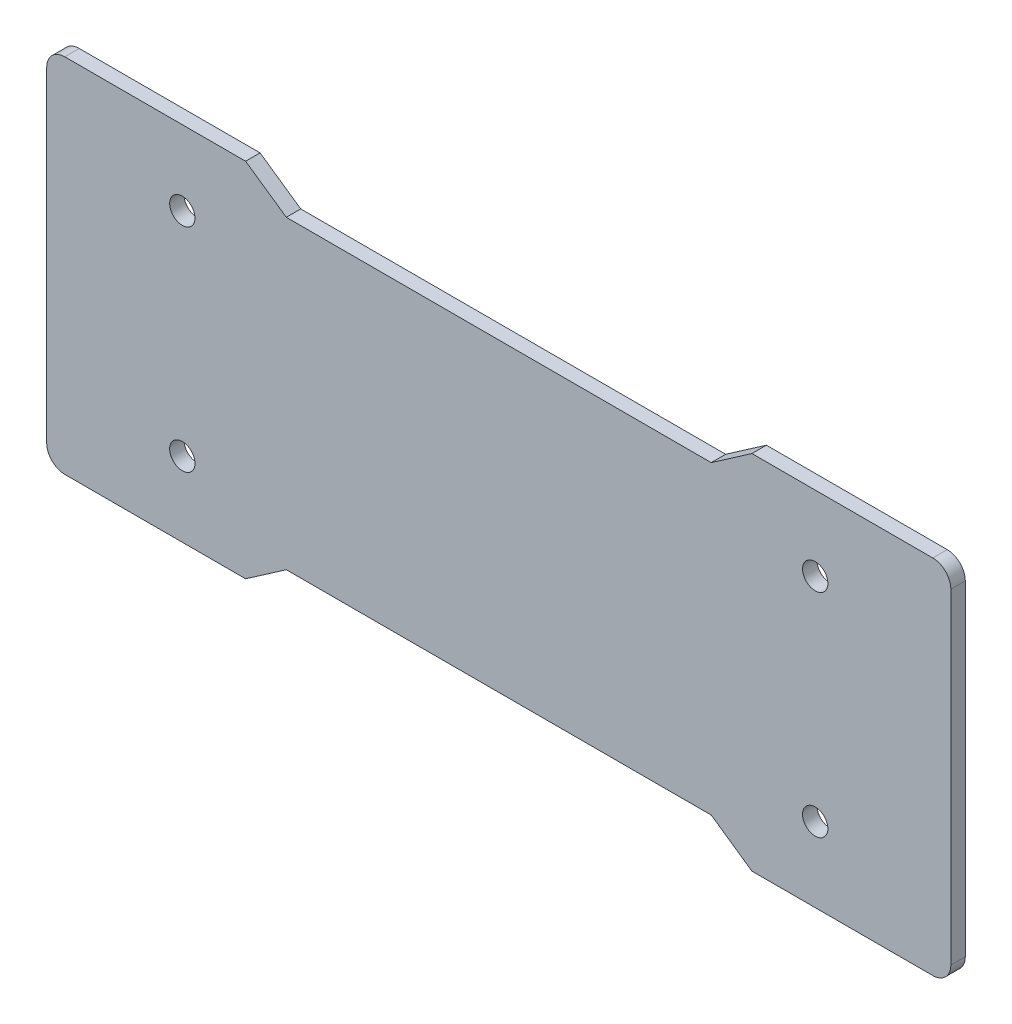
ISO-10303-21;
HEADER;
FILE_DESCRIPTION(('STEP AP214'),'2;1');
FILE_NAME('part.step','',(''),(''),'','','');
FILE_SCHEMA(('AUTOMOTIVE_DESIGN { 1 0 10303 214 1 1 1 1 }'));
ENDSEC;
DATA;
#1=APPLICATION_CONTEXT('core data for automotive mechanical design processes');
#2=APPLICATION_PROTOCOL_DEFINITION('international standard','automotive_design',2000,#1);
#3=PRODUCT_CONTEXT('',#1,'mechanical');
#4=PRODUCT('Part','Part','',(#3));
#5=PRODUCT_RELATED_PRODUCT_CATEGORY('part','',(#4));
#6=PRODUCT_DEFINITION_FORMATION('','',#4);
#7=PRODUCT_DEFINITION_CONTEXT('part definition',#1,'design');
#8=PRODUCT_DEFINITION('design','',#6,#7);
#9=PRODUCT_DEFINITION_SHAPE('','',#8);
#10=(LENGTH_UNIT() NAMED_UNIT(*) SI_UNIT(.MILLI.,.METRE.));
#11=(NAMED_UNIT(*) PLANE_ANGLE_UNIT() SI_UNIT($,.RADIAN.));
#12=(NAMED_UNIT(*) SI_UNIT($,.STERADIAN.) SOLID_ANGLE_UNIT());
#13=UNCERTAINTY_MEASURE_WITH_UNIT(LENGTH_MEASURE(1.E-05),#10,'distance_accuracy_value','');
#14=(GEOMETRIC_REPRESENTATION_CONTEXT(3) GLOBAL_UNCERTAINTY_ASSIGNED_CONTEXT((#13)) GLOBAL_UNIT_ASSIGNED_CONTEXT((#10,
#11,#12)) REPRESENTATION_CONTEXT('',''));
#15=CARTESIAN_POINT('',(0.,0.,0.));
#16=DIRECTION('',(0.,0.,1.));
#17=DIRECTION('',(1.,0.,0.));
#18=AXIS2_PLACEMENT_3D('',#15,#16,#17);
#19=CARTESIAN_POINT('',(48.,20.,1.6));
#20=DIRECTION('',(0.,-1.,0.));
#21=DIRECTION('',(1.,0.,0.));
#22=AXIS2_PLACEMENT_3D('',#19,#20,#21);
#23=PLANE('',#22);
#24=DIRECTION('',(-1.,0.,0.));
#25=VECTOR('',#24,1.);
#26=CARTESIAN_POINT('',(48.,20.,1.6));
#27=LINE('',#26,#25);
#28=CARTESIAN_POINT('',(-28.,20.,1.6));
#29=VERTEX_POINT('',#28);
#30=CARTESIAN_POINT('',(-48.,20.,1.6));
#31=VERTEX_POINT('',#30);
#32=EDGE_CURVE('E277',#29,#31,#27,.T.);
#33=ORIENTED_EDGE('',*,*,#32,.F.);
#34=DIRECTION('',(0.,0.,1.));
#35=VECTOR('',#34,1.);
#36=CARTESIAN_POINT('',(-28.,20.,0.));
#37=LINE('',#36,#35);
#38=CARTESIAN_POINT('',(-28.,20.,0.));
#39=VERTEX_POINT('',#38);
#40=EDGE_CURVE('E191',#39,#29,#37,.T.);
#41=ORIENTED_EDGE('',*,*,#40,.F.);
#42=DIRECTION('',(-1.,0.,0.));
#43=VECTOR('',#42,1.);
#44=CARTESIAN_POINT('',(48.,20.,0.));
#45=LINE('',#44,#43);
#46=CARTESIAN_POINT('',(-48.,20.,0.));
#47=VERTEX_POINT('',#46);
#48=EDGE_CURVE('E176',#39,#47,#45,.T.);
#49=ORIENTED_EDGE('',*,*,#48,.T.);
#50=DIRECTION('',(0.,0.,-1.));
#51=VECTOR('',#50,1.);
#52=CARTESIAN_POINT('',(-48.,20.,1.6));
#53=LINE('',#52,#51);
#54=EDGE_CURVE('E338',#31,#47,#53,.T.);
#55=ORIENTED_EDGE('',*,*,#54,.F.);
#56=EDGE_LOOP('',(#33,#41,#49,#55));
#57=FACE_BOUND('',#56,.T.);
#58=ADVANCED_FACE('F39',(#57),#23,.F.);
#59=CARTESIAN_POINT('',(48.,-20.,1.6));
#60=DIRECTION('',(0.,1.,0.));
#61=DIRECTION('',(-1.,0.,0.));
#62=AXIS2_PLACEMENT_3D('',#59,#60,#61);
#63=PLANE('',#62);
#64=DIRECTION('',(1.,0.,0.));
#65=VECTOR('',#64,1.);
#66=CARTESIAN_POINT('',(48.,-20.,0.));
#67=LINE('',#66,#65);
#68=CARTESIAN_POINT('',(-48.,-20.,0.));
#69=VERTEX_POINT('',#68);
#70=CARTESIAN_POINT('',(-28.,-20.,0.));
#71=VERTEX_POINT('',#70);
#72=EDGE_CURVE('E271',#69,#71,#67,.T.);
#73=ORIENTED_EDGE('',*,*,#72,.T.);
#74=DIRECTION('',(0.,0.,1.));
#75=VECTOR('',#74,1.);
#76=CARTESIAN_POINT('',(-28.,-20.,0.));
#77=LINE('',#76,#75);
#78=CARTESIAN_POINT('',(-28.,-20.,1.6));
#79=VERTEX_POINT('',#78);
#80=EDGE_CURVE('E188',#71,#79,#77,.T.);
#81=ORIENTED_EDGE('',*,*,#80,.T.);
#82=DIRECTION('',(1.,0.,0.));
#83=VECTOR('',#82,1.);
#84=CARTESIAN_POINT('',(48.,-20.,1.6));
#85=LINE('',#84,#83);
#86=CARTESIAN_POINT('',(-48.,-20.,1.6));
#87=VERTEX_POINT('',#86);
#88=EDGE_CURVE('E292',#87,#79,#85,.T.);
#89=ORIENTED_EDGE('',*,*,#88,.F.);
#90=DIRECTION('',(0.,0.,-1.));
#91=VECTOR('',#90,1.);
#92=CARTESIAN_POINT('',(-48.,-20.,1.6));
#93=LINE('',#92,#91);
#94=EDGE_CURVE('E326',#87,#69,#93,.T.);
#95=ORIENTED_EDGE('',*,*,#94,.T.);
#96=EDGE_LOOP('',(#73,#81,#89,#95));
#97=FACE_BOUND('',#96,.T.);
#98=ADVANCED_FACE('F400',(#97),#63,.F.);
#99=CARTESIAN_POINT('',(48.,-18.,1.6));
#100=DIRECTION('',(0.,0.,-1.));
#101=DIRECTION('',(-1.,0.,0.));
#102=AXIS2_PLACEMENT_3D('',#99,#100,#101);
#103=CYLINDRICAL_SURFACE('',#102,2.);
#104=CARTESIAN_POINT('',(48.,-18.,0.));
#105=DIRECTION('',(0.,0.,1.));
#106=DIRECTION('',(-1.,0.,0.));
#107=AXIS2_PLACEMENT_3D('',#104,#105,#106);
#108=CIRCLE('',#107,2.);
#109=CARTESIAN_POINT('',(48.,-20.,0.));
#110=VERTEX_POINT('',#109);
#111=CARTESIAN_POINT('',(50.,-18.,0.));
#112=VERTEX_POINT('',#111);
#113=EDGE_CURVE('E194',#110,#112,#108,.T.);
#114=ORIENTED_EDGE('',*,*,#113,.T.);
#115=DIRECTION('',(0.,0.,-1.));
#116=VECTOR('',#115,1.);
#117=CARTESIAN_POINT('',(50.,-18.,1.6));
#118=LINE('',#117,#116);
#119=CARTESIAN_POINT('',(50.,-18.,1.6));
#120=VERTEX_POINT('',#119);
#121=EDGE_CURVE('E11',#120,#112,#118,.T.);
#122=ORIENTED_EDGE('',*,*,#121,.F.);
#123=CARTESIAN_POINT('',(48.,-18.,1.6));
#124=DIRECTION('',(0.,0.,1.));
#125=DIRECTION('',(-1.,0.,0.));
#126=AXIS2_PLACEMENT_3D('',#123,#124,#125);
#127=CIRCLE('',#126,2.);
#128=CARTESIAN_POINT('',(48.,-20.,1.6));
#129=VERTEX_POINT('',#128);
#130=EDGE_CURVE('E266',#129,#120,#127,.T.);
#131=ORIENTED_EDGE('',*,*,#130,.F.);
#132=DIRECTION('',(0.,0.,-1.));
#133=VECTOR('',#132,1.);
#134=CARTESIAN_POINT('',(48.,-20.,1.6));
#135=LINE('',#134,#133);
#136=EDGE_CURVE('E296',#129,#110,#135,.T.);
#137=ORIENTED_EDGE('',*,*,#136,.T.);
#138=EDGE_LOOP('',(#114,#122,#131,#137));
#139=FACE_BOUND('',#138,.T.);
#140=ADVANCED_FACE('F41',(#139),#103,.T.);
#141=CARTESIAN_POINT('',(50.,-18.,1.6));
#142=DIRECTION('',(-1.,0.,0.));
#143=DIRECTION('',(0.,0.,1.));
#144=AXIS2_PLACEMENT_3D('',#141,#142,#143);
#145=PLANE('',#144);
#146=DIRECTION('',(0.,1.,0.));
#147=VECTOR('',#146,1.);
#148=CARTESIAN_POINT('',(50.,-18.,0.));
#149=LINE('',#148,#147);
#150=CARTESIAN_POINT('',(50.,18.,0.));
#151=VERTEX_POINT('',#150);
#152=EDGE_CURVE('E300',#112,#151,#149,.T.);
#153=ORIENTED_EDGE('',*,*,#152,.T.);
#154=DIRECTION('',(0.,0.,-1.));
#155=VECTOR('',#154,1.);
#156=CARTESIAN_POINT('',(50.,18.,1.6));
#157=LINE('',#156,#155);
#158=CARTESIAN_POINT('',(50.,18.,1.6));
#159=VERTEX_POINT('',#158);
#160=EDGE_CURVE('E48',#159,#151,#157,.T.);
#161=ORIENTED_EDGE('',*,*,#160,.F.);
#162=DIRECTION('',(0.,1.,0.));
#163=VECTOR('',#162,1.);
#164=CARTESIAN_POINT('',(50.,-18.,1.6));
#165=LINE('',#164,#163);
#166=EDGE_CURVE('E270',#120,#159,#165,.T.);
#167=ORIENTED_EDGE('',*,*,#166,.F.);
#168=ORIENTED_EDGE('',*,*,#121,.T.);
#169=EDGE_LOOP('',(#153,#161,#167,#168));
#170=FACE_BOUND('',#169,.T.);
#171=ADVANCED_FACE('F364',(#170),#145,.F.);
#172=CARTESIAN_POINT('',(48.,18.,1.6));
#173=DIRECTION('',(0.,0.,-1.));
#174=DIRECTION('',(-1.,0.,0.));
#175=AXIS2_PLACEMENT_3D('',#172,#173,#174);
#176=CYLINDRICAL_SURFACE('',#175,2.);
#177=CARTESIAN_POINT('',(48.,18.,0.));
#178=DIRECTION('',(0.,0.,1.));
#179=DIRECTION('',(1.,0.,0.));
#180=AXIS2_PLACEMENT_3D('',#177,#178,#179);
#181=CIRCLE('',#180,2.);
#182=CARTESIAN_POINT('',(48.,20.,0.));
#183=VERTEX_POINT('',#182);
#184=EDGE_CURVE('E303',#151,#183,#181,.T.);
#185=ORIENTED_EDGE('',*,*,#184,.T.);
#186=DIRECTION('',(0.,0.,-1.));
#187=VECTOR('',#186,1.);
#188=CARTESIAN_POINT('',(48.,20.,1.6));
#189=LINE('',#188,#187);
#190=CARTESIAN_POINT('',(48.,20.,1.6));
#191=VERTEX_POINT('',#190);
#192=EDGE_CURVE('E342',#191,#183,#189,.T.);
#193=ORIENTED_EDGE('',*,*,#192,.F.);
#194=CARTESIAN_POINT('',(48.,18.,1.6));
#195=DIRECTION('',(0.,0.,1.));
#196=DIRECTION('',(1.,0.,0.));
#197=AXIS2_PLACEMENT_3D('',#194,#195,#196);
#198=CIRCLE('',#197,2.);
#199=EDGE_CURVE('E274',#159,#191,#198,.T.);
#200=ORIENTED_EDGE('',*,*,#199,.F.);
#201=ORIENTED_EDGE('',*,*,#160,.T.);
#202=EDGE_LOOP('',(#185,#193,#200,#201));
#203=FACE_BOUND('',#202,.T.);
#204=ADVANCED_FACE('F351',(#203),#176,.T.);
#205=CARTESIAN_POINT('',(28.,19.9999999999997,0.));
#206=VERTEX_POINT('',#205);
#207=EDGE_CURVE('E306',#183,#206,#45,.T.);
#208=ORIENTED_EDGE('',*,*,#207,.T.);
#209=DIRECTION('',(0.,0.,1.));
#210=VECTOR('',#209,1.);
#211=CARTESIAN_POINT('',(28.,19.9999999999997,0.));
#212=LINE('',#211,#210);
#213=CARTESIAN_POINT('',(28.,19.9999999999997,1.6));
#214=VERTEX_POINT('',#213);
#215=EDGE_CURVE('E195',#206,#214,#212,.T.);
#216=ORIENTED_EDGE('',*,*,#215,.T.);
#217=EDGE_CURVE('E278',#191,#214,#27,.T.);
#218=ORIENTED_EDGE('',*,*,#217,.F.);
#219=ORIENTED_EDGE('',*,*,#192,.T.);
#220=EDGE_LOOP('',(#208,#216,#218,#219));
#221=FACE_BOUND('',#220,.T.);
#222=ADVANCED_FACE('F357',(#221),#23,.F.);
#223=CARTESIAN_POINT('',(-48.,18.,1.6));
#224=DIRECTION('',(0.,0.,-1.));
#225=DIRECTION('',(-1.,0.,0.));
#226=AXIS2_PLACEMENT_3D('',#223,#224,#225);
#227=CYLINDRICAL_SURFACE('',#226,2.);
#228=CARTESIAN_POINT('',(-48.,18.,0.));
#229=DIRECTION('',(0.,0.,1.));
#230=DIRECTION('',(-1.,0.,0.));
#231=AXIS2_PLACEMENT_3D('',#228,#229,#230);
#232=CIRCLE('',#231,2.);
#233=CARTESIAN_POINT('',(-50.,18.,0.));
#234=VERTEX_POINT('',#233);
#235=EDGE_CURVE('E310',#47,#234,#232,.T.);
#236=ORIENTED_EDGE('',*,*,#235,.T.);
#237=DIRECTION('',(0.,0.,-1.));
#238=VECTOR('',#237,1.);
#239=CARTESIAN_POINT('',(-50.,18.,1.6));
#240=LINE('',#239,#238);
#241=CARTESIAN_POINT('',(-50.,18.,1.6));
#242=VERTEX_POINT('',#241);
#243=EDGE_CURVE('E334',#242,#234,#240,.T.);
#244=ORIENTED_EDGE('',*,*,#243,.F.);
#245=CARTESIAN_POINT('',(-48.,18.,1.6));
#246=DIRECTION('',(0.,0.,1.));
#247=DIRECTION('',(-1.,0.,0.));
#248=AXIS2_PLACEMENT_3D('',#245,#246,#247);
#249=CIRCLE('',#248,2.);
#250=EDGE_CURVE('E282',#31,#242,#249,.T.);
#251=ORIENTED_EDGE('',*,*,#250,.F.);
#252=ORIENTED_EDGE('',*,*,#54,.T.);
#253=EDGE_LOOP('',(#236,#244,#251,#252));
#254=FACE_BOUND('',#253,.T.);
#255=ADVANCED_FACE('F377',(#254),#227,.T.);
#256=CARTESIAN_POINT('',(-50.,-18.,1.6));
#257=DIRECTION('',(1.,0.,0.));
#258=DIRECTION('',(0.,0.,-1.));
#259=AXIS2_PLACEMENT_3D('',#256,#257,#258);
#260=PLANE('',#259);
#261=DIRECTION('',(0.,-1.,0.));
#262=VECTOR('',#261,1.);
#263=CARTESIAN_POINT('',(-50.,-18.,0.));
#264=LINE('',#263,#262);
#265=CARTESIAN_POINT('',(-50.,-18.,0.));
#266=VERTEX_POINT('',#265);
#267=EDGE_CURVE('E313',#234,#266,#264,.T.);
#268=ORIENTED_EDGE('',*,*,#267,.T.);
#269=DIRECTION('',(0.,0.,-1.));
#270=VECTOR('',#269,1.);
#271=CARTESIAN_POINT('',(-50.,-18.,1.6));
#272=LINE('',#271,#270);
#273=CARTESIAN_POINT('',(-50.,-18.,1.6));
#274=VERTEX_POINT('',#273);
#275=EDGE_CURVE('E330',#274,#266,#272,.T.);
#276=ORIENTED_EDGE('',*,*,#275,.F.);
#277=DIRECTION('',(0.,-1.,0.));
#278=VECTOR('',#277,1.);
#279=CARTESIAN_POINT('',(-50.,-18.,1.6));
#280=LINE('',#279,#278);
#281=EDGE_CURVE('E285',#242,#274,#280,.T.);
#282=ORIENTED_EDGE('',*,*,#281,.F.);
#283=ORIENTED_EDGE('',*,*,#243,.T.);
#284=EDGE_LOOP('',(#268,#276,#282,#283));
#285=FACE_BOUND('',#284,.T.);
#286=ADVANCED_FACE('F384',(#285),#260,.F.);
#287=CARTESIAN_POINT('',(-48.,-18.,1.6));
#288=DIRECTION('',(0.,0.,-1.));
#289=DIRECTION('',(-1.,0.,0.));
#290=AXIS2_PLACEMENT_3D('',#287,#288,#289);
#291=CYLINDRICAL_SURFACE('',#290,2.);
#292=CARTESIAN_POINT('',(-48.,-18.,0.));
#293=DIRECTION('',(0.,0.,1.));
#294=DIRECTION('',(-1.,0.,0.));
#295=AXIS2_PLACEMENT_3D('',#292,#293,#294);
#296=CIRCLE('',#295,2.);
#297=EDGE_CURVE('E316',#266,#69,#296,.T.);
#298=ORIENTED_EDGE('',*,*,#297,.T.);
#299=ORIENTED_EDGE('',*,*,#94,.F.);
#300=CARTESIAN_POINT('',(-48.,-18.,1.6));
#301=DIRECTION('',(0.,0.,1.));
#302=DIRECTION('',(-1.,0.,0.));
#303=AXIS2_PLACEMENT_3D('',#300,#301,#302);
#304=CIRCLE('',#303,2.);
#305=EDGE_CURVE('E288',#274,#87,#304,.T.);
#306=ORIENTED_EDGE('',*,*,#305,.F.);
#307=ORIENTED_EDGE('',*,*,#275,.T.);
#308=EDGE_LOOP('',(#298,#299,#306,#307));
#309=FACE_BOUND('',#308,.T.);
#310=ADVANCED_FACE('F388',(#309),#291,.T.);
#311=CARTESIAN_POINT('',(28.,-19.9999999999997,1.6));
#312=VERTEX_POINT('',#311);
#313=EDGE_CURVE('E291',#312,#129,#85,.T.);
#314=ORIENTED_EDGE('',*,*,#313,.F.);
#315=DIRECTION('',(0.,0.,1.));
#316=VECTOR('',#315,1.);
#317=CARTESIAN_POINT('',(28.,-19.9999999999997,0.));
#318=LINE('',#317,#316);
#319=CARTESIAN_POINT('',(28.,-19.9999999999997,0.));
#320=VERTEX_POINT('',#319);
#321=EDGE_CURVE('E237',#320,#312,#318,.T.);
#322=ORIENTED_EDGE('',*,*,#321,.F.);
#323=EDGE_CURVE('E319',#320,#110,#67,.T.);
#324=ORIENTED_EDGE('',*,*,#323,.T.);
#325=ORIENTED_EDGE('',*,*,#136,.F.);
#326=EDGE_LOOP('',(#314,#322,#324,#325));
#327=FACE_BOUND('',#326,.T.);
#328=ADVANCED_FACE('F397',(#327),#63,.F.);
#329=CARTESIAN_POINT('',(48.,-18.,1.6));
#330=DIRECTION('',(0.,0.,-1.));
#331=DIRECTION('',(-1.,0.,0.));
#332=AXIS2_PLACEMENT_3D('',#329,#330,#331);
#333=PLANE('',#332);
#334=CARTESIAN_POINT('',(35.,11.75,1.6));
#335=DIRECTION('',(0.,0.,1.));
#336=DIRECTION('',(-1.,0.,0.));
#337=AXIS2_PLACEMENT_3D('',#334,#335,#336);
#338=CIRCLE('',#337,1.4);
#339=CARTESIAN_POINT('',(33.6,11.75,1.6));
#340=VERTEX_POINT('',#339);
#341=EDGE_CURVE('E206',#340,#340,#338,.T.);
#342=ORIENTED_EDGE('',*,*,#341,.F.);
#343=EDGE_LOOP('',(#342));
#344=FACE_BOUND('',#343,.T.);
#345=CARTESIAN_POINT('',(-35.,11.75,1.6));
#346=DIRECTION('',(0.,0.,1.));
#347=DIRECTION('',(1.,0.,0.));
#348=AXIS2_PLACEMENT_3D('',#345,#346,#347);
#349=CIRCLE('',#348,1.4);
#350=CARTESIAN_POINT('',(-33.6,11.75,1.6));
#351=VERTEX_POINT('',#350);
#352=EDGE_CURVE('E214',#351,#351,#349,.T.);
#353=ORIENTED_EDGE('',*,*,#352,.F.);
#354=EDGE_LOOP('',(#353));
#355=FACE_BOUND('',#354,.T.);
#356=CARTESIAN_POINT('',(-35.,-11.75,1.6));
#357=DIRECTION('',(0.,0.,1.));
#358=DIRECTION('',(-1.,0.,0.));
#359=AXIS2_PLACEMENT_3D('',#356,#357,#358);
#360=CIRCLE('',#359,1.4);
#361=CARTESIAN_POINT('',(-36.4,-11.75,1.6));
#362=VERTEX_POINT('',#361);
#363=EDGE_CURVE('E215',#362,#362,#360,.T.);
#364=ORIENTED_EDGE('',*,*,#363,.F.);
#365=EDGE_LOOP('',(#364));
#366=FACE_BOUND('',#365,.T.);
#367=CARTESIAN_POINT('',(35.,-11.75,1.6));
#368=DIRECTION('',(0.,0.,1.));
#369=DIRECTION('',(1.,0.,0.));
#370=AXIS2_PLACEMENT_3D('',#367,#368,#369);
#371=CIRCLE('',#370,1.4);
#372=CARTESIAN_POINT('',(36.4,-11.75,1.6));
#373=VERTEX_POINT('',#372);
#374=EDGE_CURVE('E205',#373,#373,#371,.T.);
#375=ORIENTED_EDGE('',*,*,#374,.F.);
#376=EDGE_LOOP('',(#375));
#377=FACE_BOUND('',#376,.T.);
#378=DIRECTION('',(1.,0.,0.));
#379=VECTOR('',#378,1.);
#380=CARTESIAN_POINT('',(23.5,16.8799999999998,1.6));
#381=LINE('',#380,#379);
#382=CARTESIAN_POINT('',(-23.5,16.88,1.6));
#383=VERTEX_POINT('',#382);
#384=CARTESIAN_POINT('',(23.5,16.8799999999998,1.6));
#385=VERTEX_POINT('',#384);
#386=EDGE_CURVE('E181',#383,#385,#381,.T.);
#387=ORIENTED_EDGE('',*,*,#386,.F.);
#388=DIRECTION('',(0.821797531399894,-0.569779621770593,0.));
#389=VECTOR('',#388,1.);
#390=CARTESIAN_POINT('',(-28.,20.,1.6));
#391=LINE('',#390,#389);
#392=EDGE_CURVE('E159',#29,#383,#391,.T.);
#393=ORIENTED_EDGE('',*,*,#392,.F.);
#394=ORIENTED_EDGE('',*,*,#32,.T.);
#395=ORIENTED_EDGE('',*,*,#250,.T.);
#396=ORIENTED_EDGE('',*,*,#281,.T.);
#397=ORIENTED_EDGE('',*,*,#305,.T.);
#398=ORIENTED_EDGE('',*,*,#88,.T.);
#399=DIRECTION('',(-0.821797531399894,-0.569779621770593,0.));
#400=VECTOR('',#399,1.);
#401=CARTESIAN_POINT('',(-28.,-20.,1.6));
#402=LINE('',#401,#400);
#403=CARTESIAN_POINT('',(-23.5,-16.88,1.6));
#404=VERTEX_POINT('',#403);
#405=EDGE_CURVE('E230',#404,#79,#402,.T.);
#406=ORIENTED_EDGE('',*,*,#405,.F.);
#407=DIRECTION('',(-1.,0.,0.));
#408=VECTOR('',#407,1.);
#409=CARTESIAN_POINT('',(23.5,-16.8799999999998,1.6));
#410=LINE('',#409,#408);
#411=CARTESIAN_POINT('',(23.5,-16.8799999999998,1.6));
#412=VERTEX_POINT('',#411);
#413=EDGE_CURVE('E242',#412,#404,#410,.T.);
#414=ORIENTED_EDGE('',*,*,#413,.F.);
#415=DIRECTION('',(-0.821797531399899,0.569779621770586,0.));
#416=VECTOR('',#415,1.);
#417=CARTESIAN_POINT('',(28.,-19.9999999999997,1.6));
#418=LINE('',#417,#416);
#419=EDGE_CURVE('E238',#312,#412,#418,.T.);
#420=ORIENTED_EDGE('',*,*,#419,.F.);
#421=ORIENTED_EDGE('',*,*,#313,.T.);
#422=ORIENTED_EDGE('',*,*,#130,.T.);
#423=ORIENTED_EDGE('',*,*,#166,.T.);
#424=ORIENTED_EDGE('',*,*,#199,.T.);
#425=ORIENTED_EDGE('',*,*,#217,.T.);
#426=DIRECTION('',(0.821797531399899,0.569779621770586,0.));
#427=VECTOR('',#426,1.);
#428=CARTESIAN_POINT('',(28.,19.9999999999997,1.6));
#429=LINE('',#428,#427);
#430=EDGE_CURVE('E178',#385,#214,#429,.T.);
#431=ORIENTED_EDGE('',*,*,#430,.F.);
#432=EDGE_LOOP('',(#387,#393,#394,#395,#396,#397,#398,#406,#414,#420,#421,#422,#423,#424,#425,#431));
#433=FACE_BOUND('',#432,.T.);
#434=ADVANCED_FACE('F361',(#344,#355,#366,#377,#433),#333,.F.);
#435=CARTESIAN_POINT('',(48.,-18.,0.));
#436=DIRECTION('',(0.,0.,-1.));
#437=DIRECTION('',(-1.,0.,0.));
#438=AXIS2_PLACEMENT_3D('',#435,#436,#437);
#439=PLANE('',#438);
#440=DIRECTION('',(0.821797531399894,-0.569779621770593,0.));
#441=VECTOR('',#440,1.);
#442=CARTESIAN_POINT('',(-28.,20.,0.));
#443=LINE('',#442,#441);
#444=CARTESIAN_POINT('',(-23.5,16.88,0.));
#445=VERTEX_POINT('',#444);
#446=EDGE_CURVE('E156',#39,#445,#443,.T.);
#447=ORIENTED_EDGE('',*,*,#446,.T.);
#448=DIRECTION('',(1.,0.,0.));
#449=VECTOR('',#448,1.);
#450=CARTESIAN_POINT('',(23.5,16.8799999999998,0.));
#451=LINE('',#450,#449);
#452=CARTESIAN_POINT('',(23.5,16.8799999999998,0.));
#453=VERTEX_POINT('',#452);
#454=EDGE_CURVE('E167',#445,#453,#451,.T.);
#455=ORIENTED_EDGE('',*,*,#454,.T.);
#456=DIRECTION('',(0.821797531399899,0.569779621770586,0.));
#457=VECTOR('',#456,1.);
#458=CARTESIAN_POINT('',(28.,19.9999999999997,0.));
#459=LINE('',#458,#457);
#460=EDGE_CURVE('E55',#453,#206,#459,.T.);
#461=ORIENTED_EDGE('',*,*,#460,.T.);
#462=ORIENTED_EDGE('',*,*,#207,.F.);
#463=ORIENTED_EDGE('',*,*,#184,.F.);
#464=ORIENTED_EDGE('',*,*,#152,.F.);
#465=ORIENTED_EDGE('',*,*,#113,.F.);
#466=ORIENTED_EDGE('',*,*,#323,.F.);
#467=DIRECTION('',(-0.821797531399899,0.569779621770586,0.));
#468=VECTOR('',#467,1.);
#469=CARTESIAN_POINT('',(28.,-19.9999999999997,0.));
#470=LINE('',#469,#468);
#471=CARTESIAN_POINT('',(23.5,-16.8799999999998,0.));
#472=VERTEX_POINT('',#471);
#473=EDGE_CURVE('E226',#320,#472,#470,.T.);
#474=ORIENTED_EDGE('',*,*,#473,.T.);
#475=DIRECTION('',(-1.,0.,0.));
#476=VECTOR('',#475,1.);
#477=CARTESIAN_POINT('',(23.5,-16.8799999999998,0.));
#478=LINE('',#477,#476);
#479=CARTESIAN_POINT('',(-23.5,-16.88,0.));
#480=VERTEX_POINT('',#479);
#481=EDGE_CURVE('E63',#472,#480,#478,.T.);
#482=ORIENTED_EDGE('',*,*,#481,.T.);
#483=DIRECTION('',(-0.821797531399894,-0.569779621770593,0.));
#484=VECTOR('',#483,1.);
#485=CARTESIAN_POINT('',(-28.,-20.,0.));
#486=LINE('',#485,#484);
#487=EDGE_CURVE('E233',#480,#71,#486,.T.);
#488=ORIENTED_EDGE('',*,*,#487,.T.);
#489=ORIENTED_EDGE('',*,*,#72,.F.);
#490=ORIENTED_EDGE('',*,*,#297,.F.);
#491=ORIENTED_EDGE('',*,*,#267,.F.);
#492=ORIENTED_EDGE('',*,*,#235,.F.);
#493=ORIENTED_EDGE('',*,*,#48,.F.);
#494=EDGE_LOOP('',(#447,#455,#461,#462,#463,#464,#465,#466,#474,#482,#488,#489,#490,#491,#492,#493));
#495=FACE_BOUND('',#494,.T.);
#496=CARTESIAN_POINT('',(35.,11.75,0.));
#497=DIRECTION('',(0.,0.,1.));
#498=DIRECTION('',(-1.,0.,0.));
#499=AXIS2_PLACEMENT_3D('',#496,#497,#498);
#500=CIRCLE('',#499,1.4);
#501=CARTESIAN_POINT('',(33.6,11.75,0.));
#502=VERTEX_POINT('',#501);
#503=EDGE_CURVE('E201',#502,#502,#500,.T.);
#504=ORIENTED_EDGE('',*,*,#503,.T.);
#505=EDGE_LOOP('',(#504));
#506=FACE_BOUND('',#505,.T.);
#507=CARTESIAN_POINT('',(-35.,11.75,0.));
#508=DIRECTION('',(0.,0.,1.));
#509=DIRECTION('',(1.,0.,0.));
#510=AXIS2_PLACEMENT_3D('',#507,#508,#509);
#511=CIRCLE('',#510,1.4);
#512=CARTESIAN_POINT('',(-33.6,11.75,0.));
#513=VERTEX_POINT('',#512);
#514=EDGE_CURVE('E243',#513,#513,#511,.T.);
#515=ORIENTED_EDGE('',*,*,#514,.T.);
#516=EDGE_LOOP('',(#515));
#517=FACE_BOUND('',#516,.T.);
#518=CARTESIAN_POINT('',(-35.,-11.75,0.));
#519=DIRECTION('',(0.,0.,1.));
#520=DIRECTION('',(-1.,0.,0.));
#521=AXIS2_PLACEMENT_3D('',#518,#519,#520);
#522=CIRCLE('',#521,1.4);
#523=CARTESIAN_POINT('',(-36.4,-11.75,0.));
#524=VERTEX_POINT('',#523);
#525=EDGE_CURVE('E210',#524,#524,#522,.T.);
#526=ORIENTED_EDGE('',*,*,#525,.T.);
#527=EDGE_LOOP('',(#526));
#528=FACE_BOUND('',#527,.T.);
#529=CARTESIAN_POINT('',(35.,-11.75,0.));
#530=DIRECTION('',(0.,0.,1.));
#531=DIRECTION('',(1.,0.,0.));
#532=AXIS2_PLACEMENT_3D('',#529,#530,#531);
#533=CIRCLE('',#532,1.4);
#534=CARTESIAN_POINT('',(36.4,-11.75,0.));
#535=VERTEX_POINT('',#534);
#536=EDGE_CURVE('E219',#535,#535,#533,.T.);
#537=ORIENTED_EDGE('',*,*,#536,.T.);
#538=EDGE_LOOP('',(#537));
#539=FACE_BOUND('',#538,.T.);
#540=ADVANCED_FACE('F173',(#495,#506,#517,#528,#539),#439,.T.);
#541=CARTESIAN_POINT('',(35.,-11.75,0.));
#542=DIRECTION('',(0.,0.,1.));
#543=DIRECTION('',(1.,0.,0.));
#544=AXIS2_PLACEMENT_3D('',#541,#542,#543);
#545=CYLINDRICAL_SURFACE('',#544,1.4);
#546=ORIENTED_EDGE('',*,*,#536,.F.);
#547=EDGE_LOOP('',(#546));
#548=FACE_BOUND('',#547,.T.);
#549=ORIENTED_EDGE('',*,*,#374,.T.);
#550=EDGE_LOOP('',(#549));
#551=FACE_BOUND('',#550,.T.);
#552=ADVANCED_FACE('F463',(#548,#551),#545,.F.);
#553=CARTESIAN_POINT('',(-35.,-11.75,0.));
#554=DIRECTION('',(0.,0.,1.));
#555=DIRECTION('',(1.,0.,0.));
#556=AXIS2_PLACEMENT_3D('',#553,#554,#555);
#557=CYLINDRICAL_SURFACE('',#556,1.4);
#558=ORIENTED_EDGE('',*,*,#525,.F.);
#559=EDGE_LOOP('',(#558));
#560=FACE_BOUND('',#559,.T.);
#561=ORIENTED_EDGE('',*,*,#363,.T.);
#562=EDGE_LOOP('',(#561));
#563=FACE_BOUND('',#562,.T.);
#564=ADVANCED_FACE('F471',(#560,#563),#557,.F.);
#565=CARTESIAN_POINT('',(-35.,11.75,0.));
#566=DIRECTION('',(0.,0.,1.));
#567=DIRECTION('',(1.,0.,0.));
#568=AXIS2_PLACEMENT_3D('',#565,#566,#567);
#569=CYLINDRICAL_SURFACE('',#568,1.4);
#570=ORIENTED_EDGE('',*,*,#514,.F.);
#571=EDGE_LOOP('',(#570));
#572=FACE_BOUND('',#571,.T.);
#573=ORIENTED_EDGE('',*,*,#352,.T.);
#574=EDGE_LOOP('',(#573));
#575=FACE_BOUND('',#574,.T.);
#576=ADVANCED_FACE('F481',(#572,#575),#569,.F.);
#577=CARTESIAN_POINT('',(-28.,-20.,0.));
#578=DIRECTION('',(-0.569779621770593,0.821797531399894,0.));
#579=DIRECTION('',(-0.821797531399894,-0.569779621770593,0.));
#580=AXIS2_PLACEMENT_3D('',#577,#578,#579);
#581=PLANE('',#580);
#582=ORIENTED_EDGE('',*,*,#405,.T.);
#583=ORIENTED_EDGE('',*,*,#80,.F.);
#584=ORIENTED_EDGE('',*,*,#487,.F.);
#585=DIRECTION('',(0.,0.,1.));
#586=VECTOR('',#585,1.);
#587=CARTESIAN_POINT('',(-23.5,-16.88,0.));
#588=LINE('',#587,#586);
#589=EDGE_CURVE('E252',#480,#404,#588,.T.);
#590=ORIENTED_EDGE('',*,*,#589,.T.);
#591=EDGE_LOOP('',(#582,#583,#584,#590));
#592=FACE_BOUND('',#591,.T.);
#593=ADVANCED_FACE('F491',(#592),#581,.F.);
#594=CARTESIAN_POINT('',(23.5,-16.8799999999998,0.));
#595=DIRECTION('',(0.,1.,0.));
#596=DIRECTION('',(-1.,0.,0.));
#597=AXIS2_PLACEMENT_3D('',#594,#595,#596);
#598=PLANE('',#597);
#599=ORIENTED_EDGE('',*,*,#413,.T.);
#600=ORIENTED_EDGE('',*,*,#589,.F.);
#601=ORIENTED_EDGE('',*,*,#481,.F.);
#602=DIRECTION('',(0.,0.,1.));
#603=VECTOR('',#602,1.);
#604=CARTESIAN_POINT('',(23.5,-16.8799999999998,0.));
#605=LINE('',#604,#603);
#606=EDGE_CURVE('E255',#472,#412,#605,.T.);
#607=ORIENTED_EDGE('',*,*,#606,.T.);
#608=EDGE_LOOP('',(#599,#600,#601,#607));
#609=FACE_BOUND('',#608,.T.);
#610=ADVANCED_FACE('F501',(#609),#598,.F.);
#611=CARTESIAN_POINT('',(28.,-19.9999999999997,0.));
#612=DIRECTION('',(0.569779621770586,0.821797531399899,0.));
#613=DIRECTION('',(-0.821797531399899,0.569779621770586,0.));
#614=AXIS2_PLACEMENT_3D('',#611,#612,#613);
#615=PLANE('',#614);
#616=ORIENTED_EDGE('',*,*,#419,.T.);
#617=ORIENTED_EDGE('',*,*,#606,.F.);
#618=ORIENTED_EDGE('',*,*,#473,.F.);
#619=ORIENTED_EDGE('',*,*,#321,.T.);
#620=EDGE_LOOP('',(#616,#617,#618,#619));
#621=FACE_BOUND('',#620,.T.);
#622=ADVANCED_FACE('F511',(#621),#615,.F.);
#623=CARTESIAN_POINT('',(35.,11.75,0.));
#624=DIRECTION('',(0.,0.,1.));
#625=DIRECTION('',(1.,0.,0.));
#626=AXIS2_PLACEMENT_3D('',#623,#624,#625);
#627=CYLINDRICAL_SURFACE('',#626,1.4);
#628=ORIENTED_EDGE('',*,*,#503,.F.);
#629=EDGE_LOOP('',(#628));
#630=FACE_BOUND('',#629,.T.);
#631=ORIENTED_EDGE('',*,*,#341,.T.);
#632=EDGE_LOOP('',(#631));
#633=FACE_BOUND('',#632,.T.);
#634=ADVANCED_FACE('F520',(#630,#633),#627,.F.);
#635=CARTESIAN_POINT('',(-28.,20.,0.));
#636=DIRECTION('',(-0.569779621770593,-0.821797531399894,0.));
#637=DIRECTION('',(0.821797531399894,-0.569779621770593,0.));
#638=AXIS2_PLACEMENT_3D('',#635,#636,#637);
#639=PLANE('',#638);
#640=ORIENTED_EDGE('',*,*,#392,.T.);
#641=DIRECTION('',(0.,0.,1.));
#642=VECTOR('',#641,1.);
#643=CARTESIAN_POINT('',(-23.5,16.88,0.));
#644=LINE('',#643,#642);
#645=EDGE_CURVE('E152',#445,#383,#644,.T.);
#646=ORIENTED_EDGE('',*,*,#645,.F.);
#647=ORIENTED_EDGE('',*,*,#446,.F.);
#648=ORIENTED_EDGE('',*,*,#40,.T.);
#649=EDGE_LOOP('',(#640,#646,#647,#648));
#650=FACE_BOUND('',#649,.T.);
#651=ADVANCED_FACE('F154',(#650),#639,.F.);
#652=CARTESIAN_POINT('',(28.,19.9999999999997,0.));
#653=DIRECTION('',(0.569779621770586,-0.821797531399899,0.));
#654=DIRECTION('',(0.821797531399899,0.569779621770586,0.));
#655=AXIS2_PLACEMENT_3D('',#652,#653,#654);
#656=PLANE('',#655);
#657=ORIENTED_EDGE('',*,*,#430,.T.);
#658=ORIENTED_EDGE('',*,*,#215,.F.);
#659=ORIENTED_EDGE('',*,*,#460,.F.);
#660=DIRECTION('',(0.,0.,1.));
#661=VECTOR('',#660,1.);
#662=CARTESIAN_POINT('',(23.5,16.8799999999998,0.));
#663=LINE('',#662,#661);
#664=EDGE_CURVE('E164',#453,#385,#663,.T.);
#665=ORIENTED_EDGE('',*,*,#664,.T.);
#666=EDGE_LOOP('',(#657,#658,#659,#665));
#667=FACE_BOUND('',#666,.T.);
#668=ADVANCED_FACE('F539',(#667),#656,.F.);
#669=CARTESIAN_POINT('',(23.5,16.8799999999998,0.));
#670=DIRECTION('',(0.,-1.,0.));
#671=DIRECTION('',(1.,0.,0.));
#672=AXIS2_PLACEMENT_3D('',#669,#670,#671);
#673=PLANE('',#672);
#674=ORIENTED_EDGE('',*,*,#386,.T.);
#675=ORIENTED_EDGE('',*,*,#664,.F.);
#676=ORIENTED_EDGE('',*,*,#454,.F.);
#677=ORIENTED_EDGE('',*,*,#645,.T.);
#678=EDGE_LOOP('',(#674,#675,#676,#677));
#679=FACE_BOUND('',#678,.T.);
#680=ADVANCED_FACE('F168',(#679),#673,.F.);
#681=CLOSED_SHELL('',(#58,#98,#140,#171,#204,#222,#255,#286,#310,#328,#434,#540,#552,#564,#576,
#593,#610,#622,#634,#651,#668,#680));
#682=MANIFOLD_SOLID_BREP('B2',#681);
#683=ADVANCED_BREP_SHAPE_REPRESENTATION('',(#18,#682),#14);
#684=SHAPE_DEFINITION_REPRESENTATION(#9,#683);
ENDSEC;
END-ISO-10303-21;
